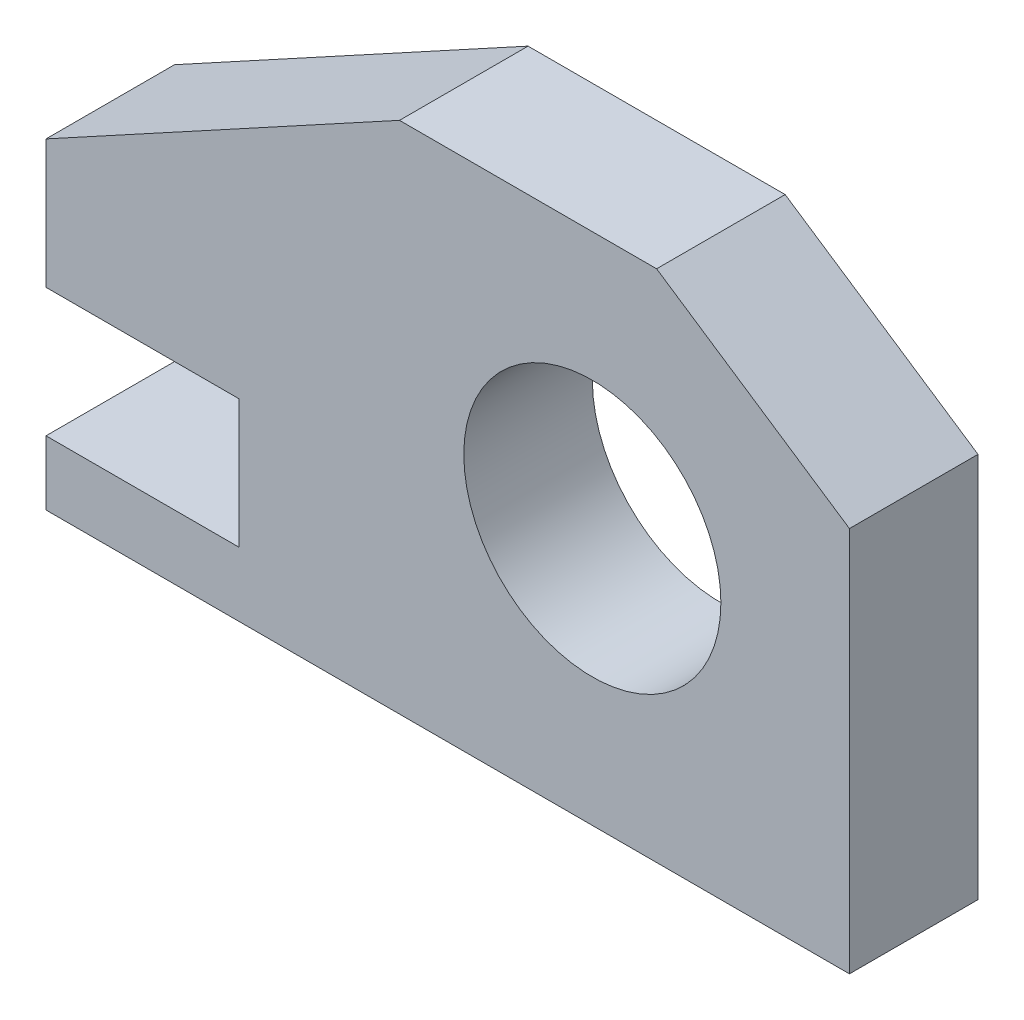
ISO-10303-21;
HEADER;
FILE_DESCRIPTION(('STEP AP214'),'2;1');
FILE_NAME('part.step','',(''),(''),'','','');
FILE_SCHEMA(('AUTOMOTIVE_DESIGN { 1 0 10303 214 1 1 1 1 }'));
ENDSEC;
DATA;
#1=APPLICATION_CONTEXT('core data for automotive mechanical design processes');
#2=APPLICATION_PROTOCOL_DEFINITION('international standard','automotive_design',2000,#1);
#3=PRODUCT_CONTEXT('',#1,'mechanical');
#4=PRODUCT('Part','Part','',(#3));
#5=PRODUCT_RELATED_PRODUCT_CATEGORY('part','',(#4));
#6=PRODUCT_DEFINITION_FORMATION('','',#4);
#7=PRODUCT_DEFINITION_CONTEXT('part definition',#1,'design');
#8=PRODUCT_DEFINITION('design','',#6,#7);
#9=PRODUCT_DEFINITION_SHAPE('','',#8);
#10=(LENGTH_UNIT() NAMED_UNIT(*) SI_UNIT(.MILLI.,.METRE.));
#11=(NAMED_UNIT(*) PLANE_ANGLE_UNIT() SI_UNIT($,.RADIAN.));
#12=(NAMED_UNIT(*) SI_UNIT($,.STERADIAN.) SOLID_ANGLE_UNIT());
#13=UNCERTAINTY_MEASURE_WITH_UNIT(LENGTH_MEASURE(1.E-05),#10,'distance_accuracy_value','');
#14=(GEOMETRIC_REPRESENTATION_CONTEXT(3) GLOBAL_UNCERTAINTY_ASSIGNED_CONTEXT((#13)) GLOBAL_UNIT_ASSIGNED_CONTEXT((#10,
#11,#12)) REPRESENTATION_CONTEXT('',''));
#15=CARTESIAN_POINT('',(0.,0.,0.));
#16=DIRECTION('',(0.,0.,1.));
#17=DIRECTION('',(1.,0.,0.));
#18=AXIS2_PLACEMENT_3D('',#15,#16,#17);
#19=CARTESIAN_POINT('',(-13.3474382729714,24.4692723106274,12.7));
#20=DIRECTION('',(-0.478867683116113,0.877887089588978,0.));
#21=DIRECTION('',(-0.877887089588978,-0.478867683116113,0.));
#22=AXIS2_PLACEMENT_3D('',#19,#20,#21);
#23=PLANE('',#22);
#24=DIRECTION('',(0.877887089588978,0.478867683116113,0.));
#25=VECTOR('',#24,1.);
#26=CARTESIAN_POINT('',(-13.3474382729714,24.4692723106274,0.));
#27=LINE('',#26,#25);
#28=CARTESIAN_POINT('',(0.,31.75,0.));
#29=VERTEX_POINT('',#28);
#30=CARTESIAN_POINT('',(34.9235282444711,50.8,0.));
#31=VERTEX_POINT('',#30);
#32=EDGE_CURVE('E144',#29,#31,#27,.T.);
#33=ORIENTED_EDGE('',*,*,#32,.F.);
#34=DIRECTION('',(0.,0.,-1.));
#35=VECTOR('',#34,1.);
#36=CARTESIAN_POINT('',(0.,31.75,12.7));
#37=LINE('',#36,#35);
#38=CARTESIAN_POINT('',(0.,31.75,12.7));
#39=VERTEX_POINT('',#38);
#40=EDGE_CURVE('E11',#39,#29,#37,.T.);
#41=ORIENTED_EDGE('',*,*,#40,.F.);
#42=DIRECTION('',(0.877887089588978,0.478867683116113,0.));
#43=VECTOR('',#42,1.);
#44=CARTESIAN_POINT('',(-13.3474382729714,24.4692723106274,12.7));
#45=LINE('',#44,#43);
#46=CARTESIAN_POINT('',(34.9235282444711,50.8,12.7));
#47=VERTEX_POINT('',#46);
#48=EDGE_CURVE('E326',#39,#47,#45,.T.);
#49=ORIENTED_EDGE('',*,*,#48,.T.);
#50=DIRECTION('',(0.,0.,-1.));
#51=VECTOR('',#50,1.);
#52=CARTESIAN_POINT('',(34.9235282444711,50.8,12.7));
#53=LINE('',#52,#51);
#54=EDGE_CURVE('E52',#47,#31,#53,.T.);
#55=ORIENTED_EDGE('',*,*,#54,.T.);
#56=EDGE_LOOP('',(#33,#41,#49,#55));
#57=FACE_BOUND('',#56,.T.);
#58=ADVANCED_FACE('F35',(#57),#23,.T.);
#59=CARTESIAN_POINT('',(0.,0.,12.7));
#60=DIRECTION('',(-1.,0.,0.));
#61=DIRECTION('',(0.,0.,1.));
#62=AXIS2_PLACEMENT_3D('',#59,#60,#61);
#63=PLANE('',#62);
#64=DIRECTION('',(0.,1.,0.));
#65=VECTOR('',#64,1.);
#66=CARTESIAN_POINT('',(0.,0.,0.));
#67=LINE('',#66,#65);
#68=CARTESIAN_POINT('',(0.,19.05,0.));
#69=VERTEX_POINT('',#68);
#70=EDGE_CURVE('E146',#69,#29,#67,.T.);
#71=ORIENTED_EDGE('',*,*,#70,.F.);
#72=DIRECTION('',(0.,0.,-1.));
#73=VECTOR('',#72,1.);
#74=CARTESIAN_POINT('',(0.,19.05,12.7));
#75=LINE('',#74,#73);
#76=CARTESIAN_POINT('',(0.,19.05,12.7));
#77=VERTEX_POINT('',#76);
#78=EDGE_CURVE('E44',#77,#69,#75,.T.);
#79=ORIENTED_EDGE('',*,*,#78,.F.);
#80=DIRECTION('',(0.,1.,0.));
#81=VECTOR('',#80,1.);
#82=CARTESIAN_POINT('',(0.,0.,12.7));
#83=LINE('',#82,#81);
#84=EDGE_CURVE('E193',#77,#39,#83,.T.);
#85=ORIENTED_EDGE('',*,*,#84,.T.);
#86=ORIENTED_EDGE('',*,*,#40,.T.);
#87=EDGE_LOOP('',(#71,#79,#85,#86));
#88=FACE_BOUND('',#87,.T.);
#89=ADVANCED_FACE('F192',(#88),#63,.T.);
#90=CARTESIAN_POINT('',(0.,19.05,12.7));
#91=DIRECTION('',(0.,1.,0.));
#92=DIRECTION('',(0.,0.,1.));
#93=AXIS2_PLACEMENT_3D('',#90,#91,#92);
#94=PLANE('',#93);
#95=DIRECTION('',(1.,0.,0.));
#96=VECTOR('',#95,1.);
#97=CARTESIAN_POINT('',(0.,19.05,0.));
#98=LINE('',#97,#96);
#99=CARTESIAN_POINT('',(19.05,19.05,0.));
#100=VERTEX_POINT('',#99);
#101=EDGE_CURVE('E149',#69,#100,#98,.T.);
#102=ORIENTED_EDGE('',*,*,#101,.T.);
#103=DIRECTION('',(0.,0.,-1.));
#104=VECTOR('',#103,1.);
#105=CARTESIAN_POINT('',(19.05,19.05,12.7));
#106=LINE('',#105,#104);
#107=CARTESIAN_POINT('',(19.05,19.05,12.7));
#108=VERTEX_POINT('',#107);
#109=EDGE_CURVE('E178',#108,#100,#106,.T.);
#110=ORIENTED_EDGE('',*,*,#109,.F.);
#111=DIRECTION('',(1.,0.,0.));
#112=VECTOR('',#111,1.);
#113=CARTESIAN_POINT('',(0.,19.05,12.7));
#114=LINE('',#113,#112);
#115=EDGE_CURVE('E184',#77,#108,#114,.T.);
#116=ORIENTED_EDGE('',*,*,#115,.F.);
#117=ORIENTED_EDGE('',*,*,#78,.T.);
#118=EDGE_LOOP('',(#102,#110,#116,#117));
#119=FACE_BOUND('',#118,.T.);
#120=ADVANCED_FACE('F182',(#119),#94,.F.);
#121=CARTESIAN_POINT('',(19.05,0.,12.7));
#122=DIRECTION('',(-1.,0.,0.));
#123=DIRECTION('',(0.,0.,1.));
#124=AXIS2_PLACEMENT_3D('',#121,#122,#123);
#125=PLANE('',#124);
#126=DIRECTION('',(0.,1.,0.));
#127=VECTOR('',#126,1.);
#128=CARTESIAN_POINT('',(19.05,0.,0.));
#129=LINE('',#128,#127);
#130=CARTESIAN_POINT('',(19.05,6.35,0.));
#131=VERTEX_POINT('',#130);
#132=EDGE_CURVE('E153',#131,#100,#129,.T.);
#133=ORIENTED_EDGE('',*,*,#132,.F.);
#134=DIRECTION('',(0.,0.,-1.));
#135=VECTOR('',#134,1.);
#136=CARTESIAN_POINT('',(19.05,6.35,12.7));
#137=LINE('',#136,#135);
#138=CARTESIAN_POINT('',(19.05,6.35,12.7));
#139=VERTEX_POINT('',#138);
#140=EDGE_CURVE('E176',#139,#131,#137,.T.);
#141=ORIENTED_EDGE('',*,*,#140,.F.);
#142=DIRECTION('',(0.,1.,0.));
#143=VECTOR('',#142,1.);
#144=CARTESIAN_POINT('',(19.05,0.,12.7));
#145=LINE('',#144,#143);
#146=EDGE_CURVE('E320',#139,#108,#145,.T.);
#147=ORIENTED_EDGE('',*,*,#146,.T.);
#148=ORIENTED_EDGE('',*,*,#109,.T.);
#149=EDGE_LOOP('',(#133,#141,#147,#148));
#150=FACE_BOUND('',#149,.T.);
#151=ADVANCED_FACE('F215',(#150),#125,.T.);
#152=CARTESIAN_POINT('',(0.,6.35,12.7));
#153=DIRECTION('',(0.,1.,0.));
#154=DIRECTION('',(0.,0.,1.));
#155=AXIS2_PLACEMENT_3D('',#152,#153,#154);
#156=PLANE('',#155);
#157=DIRECTION('',(1.,0.,0.));
#158=VECTOR('',#157,1.);
#159=CARTESIAN_POINT('',(0.,6.35,0.));
#160=LINE('',#159,#158);
#161=CARTESIAN_POINT('',(0.,6.35,0.));
#162=VERTEX_POINT('',#161);
#163=EDGE_CURVE('E156',#162,#131,#160,.T.);
#164=ORIENTED_EDGE('',*,*,#163,.F.);
#165=DIRECTION('',(0.,0.,-1.));
#166=VECTOR('',#165,1.);
#167=CARTESIAN_POINT('',(0.,6.35,12.7));
#168=LINE('',#167,#166);
#169=CARTESIAN_POINT('',(0.,6.35,12.7));
#170=VERTEX_POINT('',#169);
#171=EDGE_CURVE('E174',#170,#162,#168,.T.);
#172=ORIENTED_EDGE('',*,*,#171,.F.);
#173=DIRECTION('',(1.,0.,0.));
#174=VECTOR('',#173,1.);
#175=CARTESIAN_POINT('',(0.,6.35,12.7));
#176=LINE('',#175,#174);
#177=EDGE_CURVE('E317',#170,#139,#176,.T.);
#178=ORIENTED_EDGE('',*,*,#177,.T.);
#179=ORIENTED_EDGE('',*,*,#140,.T.);
#180=EDGE_LOOP('',(#164,#172,#178,#179));
#181=FACE_BOUND('',#180,.T.);
#182=ADVANCED_FACE('F218',(#181),#156,.T.);
#183=CARTESIAN_POINT('',(0.,0.,0.));
#184=VERTEX_POINT('',#183);
#185=EDGE_CURVE('E150',#184,#162,#67,.T.);
#186=ORIENTED_EDGE('',*,*,#185,.F.);
#187=DIRECTION('',(0.,0.,-1.));
#188=VECTOR('',#187,1.);
#189=CARTESIAN_POINT('',(0.,0.,12.7));
#190=LINE('',#189,#188);
#191=CARTESIAN_POINT('',(0.,0.,12.7));
#192=VERTEX_POINT('',#191);
#193=EDGE_CURVE('E172',#192,#184,#190,.T.);
#194=ORIENTED_EDGE('',*,*,#193,.F.);
#195=EDGE_CURVE('E314',#192,#170,#83,.T.);
#196=ORIENTED_EDGE('',*,*,#195,.T.);
#197=ORIENTED_EDGE('',*,*,#171,.T.);
#198=EDGE_LOOP('',(#186,#194,#196,#197));
#199=FACE_BOUND('',#198,.T.);
#200=ADVANCED_FACE('F211',(#199),#63,.T.);
#201=CARTESIAN_POINT('',(0.,0.,12.7));
#202=DIRECTION('',(0.,1.,0.));
#203=DIRECTION('',(0.,0.,1.));
#204=AXIS2_PLACEMENT_3D('',#201,#202,#203);
#205=PLANE('',#204);
#206=DIRECTION('',(1.,0.,0.));
#207=VECTOR('',#206,1.);
#208=CARTESIAN_POINT('',(0.,0.,0.));
#209=LINE('',#208,#207);
#210=CARTESIAN_POINT('',(79.3735282444711,0.,0.));
#211=VERTEX_POINT('',#210);
#212=EDGE_CURVE('E159',#184,#211,#209,.T.);
#213=ORIENTED_EDGE('',*,*,#212,.T.);
#214=DIRECTION('',(0.,0.,-1.));
#215=VECTOR('',#214,1.);
#216=CARTESIAN_POINT('',(79.3735282444711,0.,12.7));
#217=LINE('',#216,#215);
#218=CARTESIAN_POINT('',(79.3735282444711,0.,12.7));
#219=VERTEX_POINT('',#218);
#220=EDGE_CURVE('E133',#219,#211,#217,.T.);
#221=ORIENTED_EDGE('',*,*,#220,.F.);
#222=DIRECTION('',(1.,0.,0.));
#223=VECTOR('',#222,1.);
#224=CARTESIAN_POINT('',(0.,0.,12.7));
#225=LINE('',#224,#223);
#226=EDGE_CURVE('E122',#192,#219,#225,.T.);
#227=ORIENTED_EDGE('',*,*,#226,.F.);
#228=ORIENTED_EDGE('',*,*,#193,.T.);
#229=EDGE_LOOP('',(#213,#221,#227,#228));
#230=FACE_BOUND('',#229,.T.);
#231=ADVANCED_FACE('F224',(#230),#205,.F.);
#232=CARTESIAN_POINT('',(79.3735282444711,0.,12.7));
#233=DIRECTION('',(-1.,0.,0.));
#234=DIRECTION('',(0.,0.,1.));
#235=AXIS2_PLACEMENT_3D('',#232,#233,#234);
#236=PLANE('',#235);
#237=DIRECTION('',(0.,1.,0.));
#238=VECTOR('',#237,1.);
#239=CARTESIAN_POINT('',(79.3735282444711,0.,0.));
#240=LINE('',#239,#238);
#241=CARTESIAN_POINT('',(79.3735282444711,38.1,0.));
#242=VERTEX_POINT('',#241);
#243=EDGE_CURVE('E130',#211,#242,#240,.T.);
#244=ORIENTED_EDGE('',*,*,#243,.T.);
#245=DIRECTION('',(0.,0.,-1.));
#246=VECTOR('',#245,1.);
#247=CARTESIAN_POINT('',(79.3735282444711,38.1,12.7));
#248=LINE('',#247,#246);
#249=CARTESIAN_POINT('',(79.3735282444711,38.1,12.7));
#250=VERTEX_POINT('',#249);
#251=EDGE_CURVE('E128',#250,#242,#248,.T.);
#252=ORIENTED_EDGE('',*,*,#251,.F.);
#253=DIRECTION('',(0.,1.,0.));
#254=VECTOR('',#253,1.);
#255=CARTESIAN_POINT('',(79.3735282444711,0.,12.7));
#256=LINE('',#255,#254);
#257=EDGE_CURVE('E114',#219,#250,#256,.T.);
#258=ORIENTED_EDGE('',*,*,#257,.F.);
#259=ORIENTED_EDGE('',*,*,#220,.T.);
#260=EDGE_LOOP('',(#244,#252,#258,#259));
#261=FACE_BOUND('',#260,.T.);
#262=ADVANCED_FACE('F129',(#261),#236,.F.);
#263=CARTESIAN_POINT('',(42.0072394598373,63.0108591897559,12.7));
#264=DIRECTION('',(0.554700196225229,0.832050294337844,0.));
#265=DIRECTION('',(-0.832050294337844,0.554700196225229,0.));
#266=AXIS2_PLACEMENT_3D('',#263,#264,#265);
#267=PLANE('',#266);
#268=DIRECTION('',(0.832050294337844,-0.554700196225229,0.));
#269=VECTOR('',#268,1.);
#270=CARTESIAN_POINT('',(42.0072394598373,63.0108591897559,0.));
#271=LINE('',#270,#269);
#272=CARTESIAN_POINT('',(60.3235282444711,50.8,0.));
#273=VERTEX_POINT('',#272);
#274=EDGE_CURVE('E163',#273,#242,#271,.T.);
#275=ORIENTED_EDGE('',*,*,#274,.F.);
#276=DIRECTION('',(0.,0.,-1.));
#277=VECTOR('',#276,1.);
#278=CARTESIAN_POINT('',(60.3235282444711,50.8,12.7));
#279=LINE('',#278,#277);
#280=CARTESIAN_POINT('',(60.3235282444711,50.8,12.7));
#281=VERTEX_POINT('',#280);
#282=EDGE_CURVE('E83',#281,#273,#279,.T.);
#283=ORIENTED_EDGE('',*,*,#282,.F.);
#284=DIRECTION('',(0.832050294337844,-0.554700196225229,0.));
#285=VECTOR('',#284,1.);
#286=CARTESIAN_POINT('',(42.0072394598373,63.0108591897559,12.7));
#287=LINE('',#286,#285);
#288=EDGE_CURVE('E119',#281,#250,#287,.T.);
#289=ORIENTED_EDGE('',*,*,#288,.T.);
#290=ORIENTED_EDGE('',*,*,#251,.T.);
#291=EDGE_LOOP('',(#275,#283,#289,#290));
#292=FACE_BOUND('',#291,.T.);
#293=ADVANCED_FACE('F135',(#292),#267,.T.);
#294=CARTESIAN_POINT('',(53.9735282444711,25.4,12.7));
#295=DIRECTION('',(0.,0.,-1.));
#296=DIRECTION('',(-1.,0.,0.));
#297=AXIS2_PLACEMENT_3D('',#294,#295,#296);
#298=CYLINDRICAL_SURFACE('',#297,12.7);
#299=CARTESIAN_POINT('',(53.9735282444711,25.4,12.7));
#300=DIRECTION('',(0.,0.,1.));
#301=DIRECTION('',(1.,0.,0.));
#302=AXIS2_PLACEMENT_3D('',#299,#300,#301);
#303=CIRCLE('',#302,12.7);
#304=CARTESIAN_POINT('',(66.6735282444711,25.4,12.7));
#305=VERTEX_POINT('',#304);
#306=EDGE_CURVE('E168',#305,#305,#303,.T.);
#307=ORIENTED_EDGE('',*,*,#306,.T.);
#308=EDGE_LOOP('',(#307));
#309=FACE_BOUND('',#308,.T.);
#310=CARTESIAN_POINT('',(53.9735282444711,25.4,0.));
#311=DIRECTION('',(0.,0.,1.));
#312=DIRECTION('',(1.,0.,0.));
#313=AXIS2_PLACEMENT_3D('',#310,#311,#312);
#314=CIRCLE('',#313,12.7);
#315=CARTESIAN_POINT('',(66.6735282444711,25.4,0.));
#316=VERTEX_POINT('',#315);
#317=EDGE_CURVE('E141',#316,#316,#314,.T.);
#318=ORIENTED_EDGE('',*,*,#317,.F.);
#319=EDGE_LOOP('',(#318));
#320=FACE_BOUND('',#319,.T.);
#321=ADVANCED_FACE('F37',(#309,#320),#298,.F.);
#322=CARTESIAN_POINT('',(0.,50.8,12.7));
#323=DIRECTION('',(0.,1.,0.));
#324=DIRECTION('',(0.,0.,1.));
#325=AXIS2_PLACEMENT_3D('',#322,#323,#324);
#326=PLANE('',#325);
#327=DIRECTION('',(1.,0.,0.));
#328=VECTOR('',#327,1.);
#329=CARTESIAN_POINT('',(0.,50.8,0.));
#330=LINE('',#329,#328);
#331=EDGE_CURVE('E165',#31,#273,#330,.T.);
#332=ORIENTED_EDGE('',*,*,#331,.F.);
#333=ORIENTED_EDGE('',*,*,#54,.F.);
#334=DIRECTION('',(1.,0.,0.));
#335=VECTOR('',#334,1.);
#336=CARTESIAN_POINT('',(0.,50.8,12.7));
#337=LINE('',#336,#335);
#338=EDGE_CURVE('E136',#47,#281,#337,.T.);
#339=ORIENTED_EDGE('',*,*,#338,.T.);
#340=ORIENTED_EDGE('',*,*,#282,.T.);
#341=EDGE_LOOP('',(#332,#333,#339,#340));
#342=FACE_BOUND('',#341,.T.);
#343=ADVANCED_FACE('F194',(#342),#326,.T.);
#344=CARTESIAN_POINT('',(0.,0.,12.7));
#345=DIRECTION('',(0.,0.,1.));
#346=DIRECTION('',(1.,0.,0.));
#347=AXIS2_PLACEMENT_3D('',#344,#345,#346);
#348=PLANE('',#347);
#349=ORIENTED_EDGE('',*,*,#306,.F.);
#350=EDGE_LOOP('',(#349));
#351=FACE_BOUND('',#350,.T.);
#352=ORIENTED_EDGE('',*,*,#48,.F.);
#353=ORIENTED_EDGE('',*,*,#84,.F.);
#354=ORIENTED_EDGE('',*,*,#115,.T.);
#355=ORIENTED_EDGE('',*,*,#146,.F.);
#356=ORIENTED_EDGE('',*,*,#177,.F.);
#357=ORIENTED_EDGE('',*,*,#195,.F.);
#358=ORIENTED_EDGE('',*,*,#226,.T.);
#359=ORIENTED_EDGE('',*,*,#257,.T.);
#360=ORIENTED_EDGE('',*,*,#288,.F.);
#361=ORIENTED_EDGE('',*,*,#338,.F.);
#362=EDGE_LOOP('',(#352,#353,#354,#355,#356,#357,#358,#359,#360,#361));
#363=FACE_BOUND('',#362,.T.);
#364=ADVANCED_FACE('F116',(#351,#363),#348,.T.);
#365=CARTESIAN_POINT('',(0.,0.,0.));
#366=DIRECTION('',(0.,0.,1.));
#367=DIRECTION('',(1.,0.,0.));
#368=AXIS2_PLACEMENT_3D('',#365,#366,#367);
#369=PLANE('',#368);
#370=ORIENTED_EDGE('',*,*,#317,.T.);
#371=EDGE_LOOP('',(#370));
#372=FACE_BOUND('',#371,.T.);
#373=ORIENTED_EDGE('',*,*,#32,.T.);
#374=ORIENTED_EDGE('',*,*,#331,.T.);
#375=ORIENTED_EDGE('',*,*,#274,.T.);
#376=ORIENTED_EDGE('',*,*,#243,.F.);
#377=ORIENTED_EDGE('',*,*,#212,.F.);
#378=ORIENTED_EDGE('',*,*,#185,.T.);
#379=ORIENTED_EDGE('',*,*,#163,.T.);
#380=ORIENTED_EDGE('',*,*,#132,.T.);
#381=ORIENTED_EDGE('',*,*,#101,.F.);
#382=ORIENTED_EDGE('',*,*,#70,.T.);
#383=EDGE_LOOP('',(#373,#374,#375,#376,#377,#378,#379,#380,#381,#382));
#384=FACE_BOUND('',#383,.T.);
#385=ADVANCED_FACE('F190',(#372,#384),#369,.F.);
#386=CLOSED_SHELL('',(#58,#89,#120,#151,#182,#200,#231,#262,#293,#321,#343,#364,#385));
#387=MANIFOLD_SOLID_BREP('B2',#386);
#388=ADVANCED_BREP_SHAPE_REPRESENTATION('',(#18,#387),#14);
#389=SHAPE_DEFINITION_REPRESENTATION(#9,#388);
ENDSEC;
END-ISO-10303-21;
